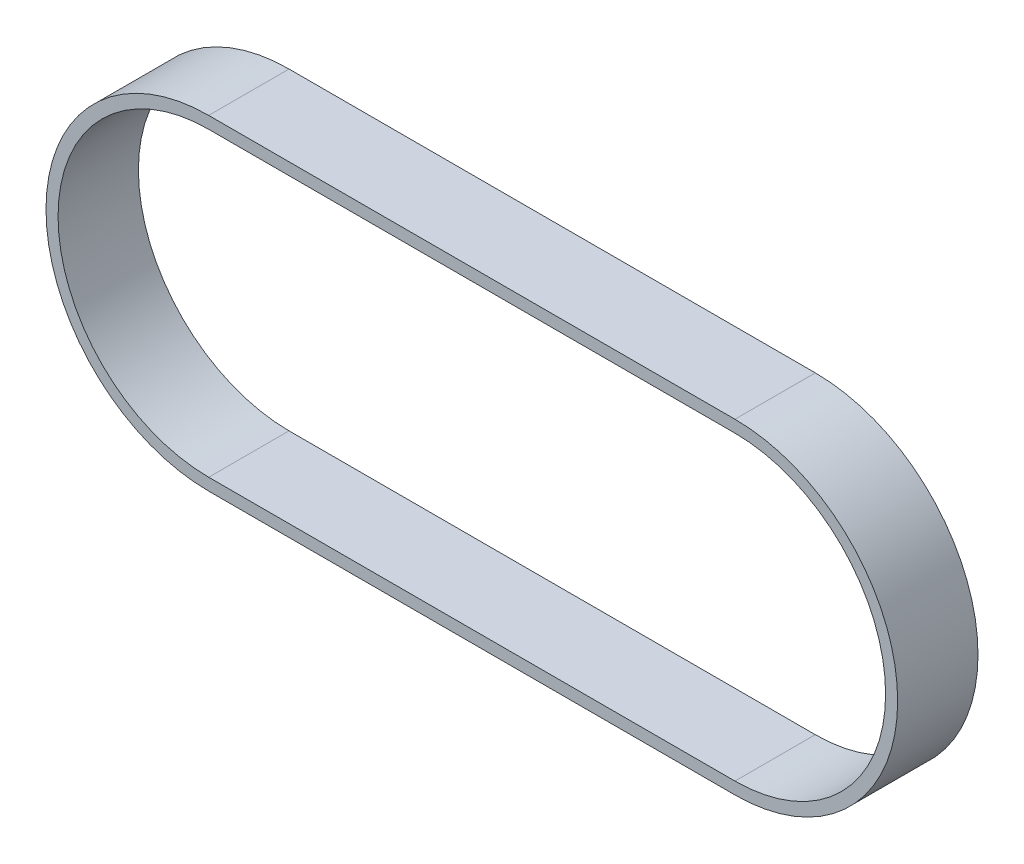
ISO-10303-21;
HEADER;
FILE_DESCRIPTION(('STEP AP214'),'2;1');
FILE_NAME('part.step','',(''),(''),'','','');
FILE_SCHEMA(('AUTOMOTIVE_DESIGN { 1 0 10303 214 1 1 1 1 }'));
ENDSEC;
DATA;
#1=APPLICATION_CONTEXT('core data for automotive mechanical design processes');
#2=APPLICATION_PROTOCOL_DEFINITION('international standard','automotive_design',2000,#1);
#3=PRODUCT_CONTEXT('',#1,'mechanical');
#4=PRODUCT('Part','Part','',(#3));
#5=PRODUCT_RELATED_PRODUCT_CATEGORY('part','',(#4));
#6=PRODUCT_DEFINITION_FORMATION('','',#4);
#7=PRODUCT_DEFINITION_CONTEXT('part definition',#1,'design');
#8=PRODUCT_DEFINITION('design','',#6,#7);
#9=PRODUCT_DEFINITION_SHAPE('','',#8);
#10=(LENGTH_UNIT() NAMED_UNIT(*) SI_UNIT(.MILLI.,.METRE.));
#11=(NAMED_UNIT(*) PLANE_ANGLE_UNIT() SI_UNIT($,.RADIAN.));
#12=(NAMED_UNIT(*) SI_UNIT($,.STERADIAN.) SOLID_ANGLE_UNIT());
#13=UNCERTAINTY_MEASURE_WITH_UNIT(LENGTH_MEASURE(1.E-05),#10,'distance_accuracy_value','');
#14=(GEOMETRIC_REPRESENTATION_CONTEXT(3) GLOBAL_UNCERTAINTY_ASSIGNED_CONTEXT((#13)) GLOBAL_UNIT_ASSIGNED_CONTEXT((#10,
#11,#12)) REPRESENTATION_CONTEXT('',''));
#15=CARTESIAN_POINT('',(0.,0.,0.));
#16=DIRECTION('',(0.,0.,1.));
#17=DIRECTION('',(1.,0.,0.));
#18=AXIS2_PLACEMENT_3D('',#15,#16,#17);
#19=CARTESIAN_POINT('',(0.,0.,20.));
#20=DIRECTION('',(0.,0.,1.));
#21=DIRECTION('',(1.,0.,0.));
#22=AXIS2_PLACEMENT_3D('',#19,#20,#21);
#23=PLANE('',#22);
#24=CARTESIAN_POINT('',(0.,0.,20.));
#25=DIRECTION('',(0.,0.,1.));
#26=DIRECTION('',(1.,0.,0.));
#27=AXIS2_PLACEMENT_3D('',#24,#25,#26);
#28=CIRCLE('',#27,40.5);
#29=CARTESIAN_POINT('',(0.,40.5,20.));
#30=VERTEX_POINT('',#29);
#31=CARTESIAN_POINT('',(0.,-40.5,20.));
#32=VERTEX_POINT('',#31);
#33=EDGE_CURVE('E169',#30,#32,#28,.T.);
#34=ORIENTED_EDGE('',*,*,#33,.T.);
#35=DIRECTION('',(1.,0.,0.));
#36=VECTOR('',#35,1.);
#37=CARTESIAN_POINT('',(0.,-40.5,20.));
#38=LINE('',#37,#36);
#39=CARTESIAN_POINT('',(131.,-40.5,20.));
#40=VERTEX_POINT('',#39);
#41=EDGE_CURVE('E172',#32,#40,#38,.T.);
#42=ORIENTED_EDGE('',*,*,#41,.T.);
#43=CARTESIAN_POINT('',(131.,0.,20.));
#44=DIRECTION('',(0.,0.,1.));
#45=DIRECTION('',(1.,0.,0.));
#46=AXIS2_PLACEMENT_3D('',#43,#44,#45);
#47=CIRCLE('',#46,40.5);
#48=CARTESIAN_POINT('',(131.,40.5,20.));
#49=VERTEX_POINT('',#48);
#50=EDGE_CURVE('E171',#40,#49,#47,.T.);
#51=ORIENTED_EDGE('',*,*,#50,.T.);
#52=DIRECTION('',(-1.,0.,0.));
#53=VECTOR('',#52,1.);
#54=CARTESIAN_POINT('',(0.,40.5,20.));
#55=LINE('',#54,#53);
#56=EDGE_CURVE('E178',#49,#30,#55,.T.);
#57=ORIENTED_EDGE('',*,*,#56,.T.);
#58=EDGE_LOOP('',(#34,#42,#51,#57));
#59=FACE_BOUND('',#58,.T.);
#60=DIRECTION('',(1.,0.,0.));
#61=VECTOR('',#60,1.);
#62=CARTESIAN_POINT('',(0.,-37.5,20.));
#63=LINE('',#62,#61);
#64=CARTESIAN_POINT('',(0.,-37.5,20.));
#65=VERTEX_POINT('',#64);
#66=CARTESIAN_POINT('',(131.,-37.5,20.));
#67=VERTEX_POINT('',#66);
#68=EDGE_CURVE('E136',#65,#67,#63,.T.);
#69=ORIENTED_EDGE('',*,*,#68,.F.);
#70=CARTESIAN_POINT('',(0.,0.,20.));
#71=DIRECTION('',(0.,0.,1.));
#72=DIRECTION('',(1.,0.,0.));
#73=AXIS2_PLACEMENT_3D('',#70,#71,#72);
#74=CIRCLE('',#73,37.5);
#75=CARTESIAN_POINT('',(0.,37.5,20.));
#76=VERTEX_POINT('',#75);
#77=EDGE_CURVE('E135',#76,#65,#74,.T.);
#78=ORIENTED_EDGE('',*,*,#77,.F.);
#79=DIRECTION('',(-1.,0.,0.));
#80=VECTOR('',#79,1.);
#81=CARTESIAN_POINT('',(0.,37.5,20.));
#82=LINE('',#81,#80);
#83=CARTESIAN_POINT('',(131.,37.5,20.));
#84=VERTEX_POINT('',#83);
#85=EDGE_CURVE('E152',#84,#76,#82,.T.);
#86=ORIENTED_EDGE('',*,*,#85,.F.);
#87=CARTESIAN_POINT('',(131.,0.,20.));
#88=DIRECTION('',(0.,0.,1.));
#89=DIRECTION('',(1.,0.,0.));
#90=AXIS2_PLACEMENT_3D('',#87,#88,#89);
#91=CIRCLE('',#90,37.5);
#92=EDGE_CURVE('E155',#67,#84,#91,.T.);
#93=ORIENTED_EDGE('',*,*,#92,.F.);
#94=EDGE_LOOP('',(#69,#78,#86,#93));
#95=FACE_BOUND('',#94,.T.);
#96=ADVANCED_FACE('F69',(#59,#95),#23,.T.);
#97=CARTESIAN_POINT('',(0.,0.,0.));
#98=DIRECTION('',(0.,0.,1.));
#99=DIRECTION('',(1.,0.,0.));
#100=AXIS2_PLACEMENT_3D('',#97,#98,#99);
#101=PLANE('',#100);
#102=CARTESIAN_POINT('',(0.,0.,0.));
#103=DIRECTION('',(0.,0.,1.));
#104=DIRECTION('',(1.,0.,0.));
#105=AXIS2_PLACEMENT_3D('',#102,#103,#104);
#106=CIRCLE('',#105,40.5);
#107=CARTESIAN_POINT('',(0.,40.5,0.));
#108=VERTEX_POINT('',#107);
#109=CARTESIAN_POINT('',(0.,-40.5,0.));
#110=VERTEX_POINT('',#109);
#111=EDGE_CURVE('E146',#108,#110,#106,.T.);
#112=ORIENTED_EDGE('',*,*,#111,.F.);
#113=DIRECTION('',(-1.,0.,0.));
#114=VECTOR('',#113,1.);
#115=CARTESIAN_POINT('',(0.,40.5,0.));
#116=LINE('',#115,#114);
#117=CARTESIAN_POINT('',(131.,40.5,0.));
#118=VERTEX_POINT('',#117);
#119=EDGE_CURVE('E175',#118,#108,#116,.T.);
#120=ORIENTED_EDGE('',*,*,#119,.F.);
#121=CARTESIAN_POINT('',(131.,0.,0.));
#122=DIRECTION('',(0.,0.,1.));
#123=DIRECTION('',(1.,0.,0.));
#124=AXIS2_PLACEMENT_3D('',#121,#122,#123);
#125=CIRCLE('',#124,40.5);
#126=CARTESIAN_POINT('',(131.,-40.5,0.));
#127=VERTEX_POINT('',#126);
#128=EDGE_CURVE('E181',#127,#118,#125,.T.);
#129=ORIENTED_EDGE('',*,*,#128,.F.);
#130=DIRECTION('',(1.,0.,0.));
#131=VECTOR('',#130,1.);
#132=CARTESIAN_POINT('',(0.,-40.5,0.));
#133=LINE('',#132,#131);
#134=EDGE_CURVE('E182',#110,#127,#133,.T.);
#135=ORIENTED_EDGE('',*,*,#134,.F.);
#136=EDGE_LOOP('',(#112,#120,#129,#135));
#137=FACE_BOUND('',#136,.T.);
#138=CARTESIAN_POINT('',(0.,0.,0.));
#139=DIRECTION('',(0.,0.,1.));
#140=DIRECTION('',(1.,0.,0.));
#141=AXIS2_PLACEMENT_3D('',#138,#139,#140);
#142=CIRCLE('',#141,37.5);
#143=CARTESIAN_POINT('',(0.,37.5,0.));
#144=VERTEX_POINT('',#143);
#145=CARTESIAN_POINT('',(0.,-37.5,0.));
#146=VERTEX_POINT('',#145);
#147=EDGE_CURVE('E89',#144,#146,#142,.T.);
#148=ORIENTED_EDGE('',*,*,#147,.T.);
#149=DIRECTION('',(1.,0.,0.));
#150=VECTOR('',#149,1.);
#151=CARTESIAN_POINT('',(0.,-37.5,0.));
#152=LINE('',#151,#150);
#153=CARTESIAN_POINT('',(131.,-37.5,0.));
#154=VERTEX_POINT('',#153);
#155=EDGE_CURVE('E150',#146,#154,#152,.T.);
#156=ORIENTED_EDGE('',*,*,#155,.T.);
#157=CARTESIAN_POINT('',(131.,0.,0.));
#158=DIRECTION('',(0.,0.,1.));
#159=DIRECTION('',(1.,0.,0.));
#160=AXIS2_PLACEMENT_3D('',#157,#158,#159);
#161=CIRCLE('',#160,37.5);
#162=CARTESIAN_POINT('',(131.,37.5,0.));
#163=VERTEX_POINT('',#162);
#164=EDGE_CURVE('E159',#154,#163,#161,.T.);
#165=ORIENTED_EDGE('',*,*,#164,.T.);
#166=DIRECTION('',(-1.,0.,0.));
#167=VECTOR('',#166,1.);
#168=CARTESIAN_POINT('',(0.,37.5,0.));
#169=LINE('',#168,#167);
#170=EDGE_CURVE('E143',#163,#144,#169,.T.);
#171=ORIENTED_EDGE('',*,*,#170,.T.);
#172=EDGE_LOOP('',(#148,#156,#165,#171));
#173=FACE_BOUND('',#172,.T.);
#174=ADVANCED_FACE('F203',(#137,#173),#101,.F.);
#175=CARTESIAN_POINT('',(0.,0.,20.));
#176=DIRECTION('',(0.,0.,-1.));
#177=DIRECTION('',(-1.,0.,0.));
#178=AXIS2_PLACEMENT_3D('',#175,#176,#177);
#179=CYLINDRICAL_SURFACE('',#178,40.5);
#180=ORIENTED_EDGE('',*,*,#111,.T.);
#181=DIRECTION('',(0.,0.,-1.));
#182=VECTOR('',#181,1.);
#183=CARTESIAN_POINT('',(0.,-40.5,20.));
#184=LINE('',#183,#182);
#185=EDGE_CURVE('E12',#32,#110,#184,.T.);
#186=ORIENTED_EDGE('',*,*,#185,.F.);
#187=ORIENTED_EDGE('',*,*,#33,.F.);
#188=DIRECTION('',(0.,0.,-1.));
#189=VECTOR('',#188,1.);
#190=CARTESIAN_POINT('',(0.,40.5,20.));
#191=LINE('',#190,#189);
#192=EDGE_CURVE('E177',#30,#108,#191,.T.);
#193=ORIENTED_EDGE('',*,*,#192,.T.);
#194=EDGE_LOOP('',(#180,#186,#187,#193));
#195=FACE_BOUND('',#194,.T.);
#196=ADVANCED_FACE('F70',(#195),#179,.T.);
#197=CARTESIAN_POINT('',(0.,-40.5,20.));
#198=DIRECTION('',(0.,1.,0.));
#199=DIRECTION('',(0.,0.,1.));
#200=AXIS2_PLACEMENT_3D('',#197,#198,#199);
#201=PLANE('',#200);
#202=ORIENTED_EDGE('',*,*,#134,.T.);
#203=DIRECTION('',(0.,0.,-1.));
#204=VECTOR('',#203,1.);
#205=CARTESIAN_POINT('',(131.,-40.5,20.));
#206=LINE('',#205,#204);
#207=EDGE_CURVE('E73',#40,#127,#206,.T.);
#208=ORIENTED_EDGE('',*,*,#207,.F.);
#209=ORIENTED_EDGE('',*,*,#41,.F.);
#210=ORIENTED_EDGE('',*,*,#185,.T.);
#211=EDGE_LOOP('',(#202,#208,#209,#210));
#212=FACE_BOUND('',#211,.T.);
#213=ADVANCED_FACE('F211',(#212),#201,.F.);
#214=CARTESIAN_POINT('',(131.,0.,20.));
#215=DIRECTION('',(0.,0.,-1.));
#216=DIRECTION('',(-1.,0.,0.));
#217=AXIS2_PLACEMENT_3D('',#214,#215,#216);
#218=CYLINDRICAL_SURFACE('',#217,40.5);
#219=ORIENTED_EDGE('',*,*,#128,.T.);
#220=DIRECTION('',(0.,0.,-1.));
#221=VECTOR('',#220,1.);
#222=CARTESIAN_POINT('',(131.,40.5,20.));
#223=LINE('',#222,#221);
#224=EDGE_CURVE('E189',#49,#118,#223,.T.);
#225=ORIENTED_EDGE('',*,*,#224,.F.);
#226=ORIENTED_EDGE('',*,*,#50,.F.);
#227=ORIENTED_EDGE('',*,*,#207,.T.);
#228=EDGE_LOOP('',(#219,#225,#226,#227));
#229=FACE_BOUND('',#228,.T.);
#230=ADVANCED_FACE('F191',(#229),#218,.T.);
#231=CARTESIAN_POINT('',(0.,40.5,20.));
#232=DIRECTION('',(0.,-1.,0.));
#233=DIRECTION('',(1.,0.,0.));
#234=AXIS2_PLACEMENT_3D('',#231,#232,#233);
#235=PLANE('',#234);
#236=ORIENTED_EDGE('',*,*,#119,.T.);
#237=ORIENTED_EDGE('',*,*,#192,.F.);
#238=ORIENTED_EDGE('',*,*,#56,.F.);
#239=ORIENTED_EDGE('',*,*,#224,.T.);
#240=EDGE_LOOP('',(#236,#237,#238,#239));
#241=FACE_BOUND('',#240,.T.);
#242=ADVANCED_FACE('F202',(#241),#235,.F.);
#243=CARTESIAN_POINT('',(0.,0.,20.));
#244=DIRECTION('',(0.,0.,-1.));
#245=DIRECTION('',(-1.,0.,0.));
#246=AXIS2_PLACEMENT_3D('',#243,#244,#245);
#247=CYLINDRICAL_SURFACE('',#246,37.5);
#248=ORIENTED_EDGE('',*,*,#147,.F.);
#249=DIRECTION('',(0.,0.,-1.));
#250=VECTOR('',#249,1.);
#251=CARTESIAN_POINT('',(0.,37.5,20.));
#252=LINE('',#251,#250);
#253=EDGE_CURVE('E138',#76,#144,#252,.T.);
#254=ORIENTED_EDGE('',*,*,#253,.F.);
#255=ORIENTED_EDGE('',*,*,#77,.T.);
#256=DIRECTION('',(0.,0.,-1.));
#257=VECTOR('',#256,1.);
#258=CARTESIAN_POINT('',(0.,-37.5,20.));
#259=LINE('',#258,#257);
#260=EDGE_CURVE('E133',#65,#146,#259,.T.);
#261=ORIENTED_EDGE('',*,*,#260,.T.);
#262=EDGE_LOOP('',(#248,#254,#255,#261));
#263=FACE_BOUND('',#262,.T.);
#264=ADVANCED_FACE('F131',(#263),#247,.F.);
#265=CARTESIAN_POINT('',(0.,-37.5,20.));
#266=DIRECTION('',(0.,1.,0.));
#267=DIRECTION('',(0.,0.,1.));
#268=AXIS2_PLACEMENT_3D('',#265,#266,#267);
#269=PLANE('',#268);
#270=ORIENTED_EDGE('',*,*,#155,.F.);
#271=ORIENTED_EDGE('',*,*,#260,.F.);
#272=ORIENTED_EDGE('',*,*,#68,.T.);
#273=DIRECTION('',(0.,0.,-1.));
#274=VECTOR('',#273,1.);
#275=CARTESIAN_POINT('',(131.,-37.5,20.));
#276=LINE('',#275,#274);
#277=EDGE_CURVE('E149',#67,#154,#276,.T.);
#278=ORIENTED_EDGE('',*,*,#277,.T.);
#279=EDGE_LOOP('',(#270,#271,#272,#278));
#280=FACE_BOUND('',#279,.T.);
#281=ADVANCED_FACE('F145',(#280),#269,.T.);
#282=CARTESIAN_POINT('',(131.,0.,20.));
#283=DIRECTION('',(0.,0.,-1.));
#284=DIRECTION('',(-1.,0.,0.));
#285=AXIS2_PLACEMENT_3D('',#282,#283,#284);
#286=CYLINDRICAL_SURFACE('',#285,37.5);
#287=ORIENTED_EDGE('',*,*,#164,.F.);
#288=ORIENTED_EDGE('',*,*,#277,.F.);
#289=ORIENTED_EDGE('',*,*,#92,.T.);
#290=DIRECTION('',(0.,0.,-1.));
#291=VECTOR('',#290,1.);
#292=CARTESIAN_POINT('',(131.,37.5,20.));
#293=LINE('',#292,#291);
#294=EDGE_CURVE('E84',#84,#163,#293,.T.);
#295=ORIENTED_EDGE('',*,*,#294,.T.);
#296=EDGE_LOOP('',(#287,#288,#289,#295));
#297=FACE_BOUND('',#296,.T.);
#298=ADVANCED_FACE('F235',(#297),#286,.F.);
#299=CARTESIAN_POINT('',(0.,37.5,20.));
#300=DIRECTION('',(0.,-1.,0.));
#301=DIRECTION('',(1.,0.,0.));
#302=AXIS2_PLACEMENT_3D('',#299,#300,#301);
#303=PLANE('',#302);
#304=ORIENTED_EDGE('',*,*,#170,.F.);
#305=ORIENTED_EDGE('',*,*,#294,.F.);
#306=ORIENTED_EDGE('',*,*,#85,.T.);
#307=ORIENTED_EDGE('',*,*,#253,.T.);
#308=EDGE_LOOP('',(#304,#305,#306,#307));
#309=FACE_BOUND('',#308,.T.);
#310=ADVANCED_FACE('F236',(#309),#303,.T.);
#311=CLOSED_SHELL('',(#96,#174,#196,#213,#230,#242,#264,#281,#298,#310));
#312=MANIFOLD_SOLID_BREP('B2',#311);
#313=ADVANCED_BREP_SHAPE_REPRESENTATION('',(#18,#312),#14);
#314=SHAPE_DEFINITION_REPRESENTATION(#9,#313);
ENDSEC;
END-ISO-10303-21;
